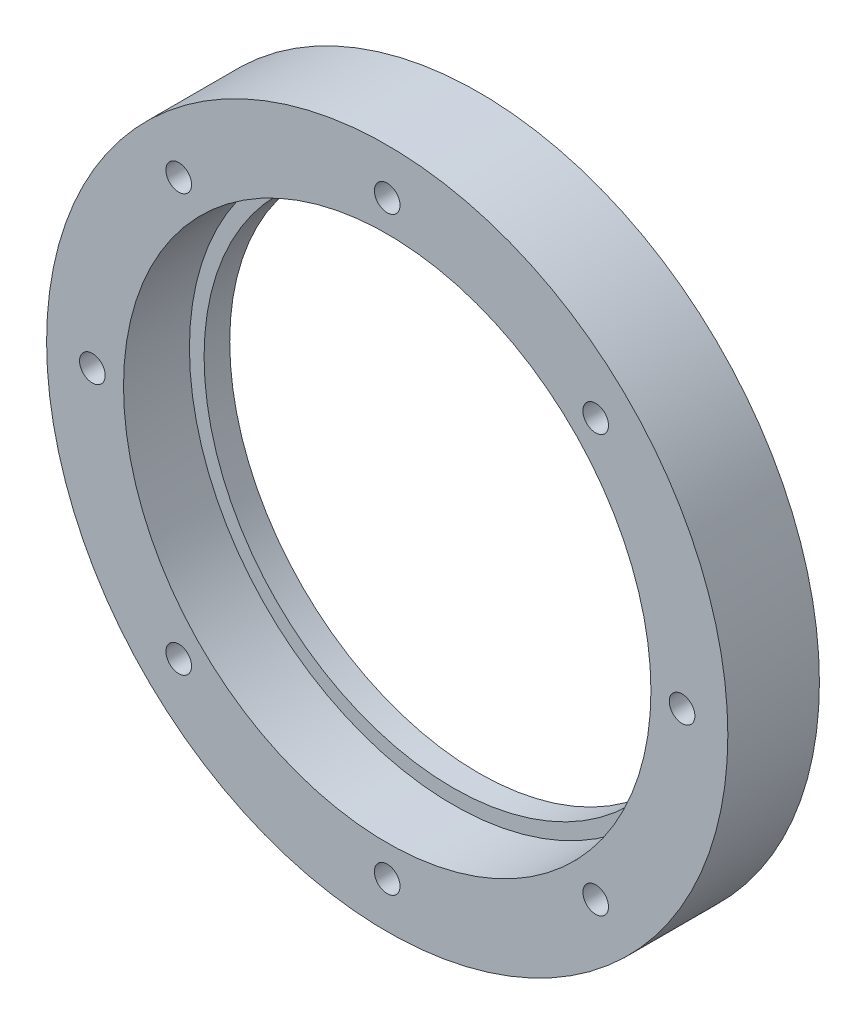
ISO-10303-21;
HEADER;
FILE_DESCRIPTION(('STEP AP214'),'2;1');
FILE_NAME('part.step','',(''),(''),'','','');
FILE_SCHEMA(('AUTOMOTIVE_DESIGN { 1 0 10303 214 1 1 1 1 }'));
ENDSEC;
DATA;
#1=APPLICATION_CONTEXT('core data for automotive mechanical design processes');
#2=APPLICATION_PROTOCOL_DEFINITION('international standard','automotive_design',2000,#1);
#3=PRODUCT_CONTEXT('',#1,'mechanical');
#4=PRODUCT('Part','Part','',(#3));
#5=PRODUCT_RELATED_PRODUCT_CATEGORY('part','',(#4));
#6=PRODUCT_DEFINITION_FORMATION('','',#4);
#7=PRODUCT_DEFINITION_CONTEXT('part definition',#1,'design');
#8=PRODUCT_DEFINITION('design','',#6,#7);
#9=PRODUCT_DEFINITION_SHAPE('','',#8);
#10=(LENGTH_UNIT() NAMED_UNIT(*) SI_UNIT(.MILLI.,.METRE.));
#11=(NAMED_UNIT(*) PLANE_ANGLE_UNIT() SI_UNIT($,.RADIAN.));
#12=(NAMED_UNIT(*) SI_UNIT($,.STERADIAN.) SOLID_ANGLE_UNIT());
#13=UNCERTAINTY_MEASURE_WITH_UNIT(LENGTH_MEASURE(1.E-05),#10,'distance_accuracy_value','');
#14=(GEOMETRIC_REPRESENTATION_CONTEXT(3) GLOBAL_UNCERTAINTY_ASSIGNED_CONTEXT((#13)) GLOBAL_UNIT_ASSIGNED_CONTEXT((#10,
#11,#12)) REPRESENTATION_CONTEXT('',''));
#15=CARTESIAN_POINT('',(0.,0.,0.));
#16=DIRECTION('',(0.,0.,1.));
#17=DIRECTION('',(1.,0.,0.));
#18=AXIS2_PLACEMENT_3D('',#15,#16,#17);
#19=CARTESIAN_POINT('',(0.,0.,6.25));
#20=DIRECTION('',(0.,0.,1.));
#21=DIRECTION('',(1.,0.,0.));
#22=AXIS2_PLACEMENT_3D('',#19,#20,#21);
#23=PLANE('',#22);
#24=CARTESIAN_POINT('',(40.25,-1.40532123888436E-13,6.25));
#25=DIRECTION('',(0.,0.,1.));
#26=DIRECTION('',(0.,-1.,0.));
#27=AXIS2_PLACEMENT_3D('',#24,#25,#26);
#28=CIRCLE('',#27,1.75);
#29=CARTESIAN_POINT('',(40.25,-1.75000000000014,6.25));
#30=VERTEX_POINT('',#29);
#31=EDGE_CURVE('E99',#30,#30,#28,.T.);
#32=ORIENTED_EDGE('',*,*,#31,.F.);
#33=EDGE_LOOP('',(#32));
#34=FACE_BOUND('',#33,.T.);
#35=CARTESIAN_POINT('',(28.4610479427584,-28.4610479427587,6.25));
#36=DIRECTION('',(0.,0.,1.));
#37=DIRECTION('',(-0.707106781186551,-0.707106781186544,0.));
#38=AXIS2_PLACEMENT_3D('',#35,#36,#37);
#39=CIRCLE('',#38,1.75);
#40=CARTESIAN_POINT('',(27.2236110756819,-29.6984848098351,6.25));
#41=VERTEX_POINT('',#40);
#42=EDGE_CURVE('E93',#41,#41,#39,.T.);
#43=ORIENTED_EDGE('',*,*,#42,.F.);
#44=EDGE_LOOP('',(#43));
#45=FACE_BOUND('',#44,.T.);
#46=CARTESIAN_POINT('',(0.,-40.25,6.25));
#47=DIRECTION('',(0.,0.,1.));
#48=DIRECTION('',(-1.,0.,0.));
#49=AXIS2_PLACEMENT_3D('',#46,#47,#48);
#50=CIRCLE('',#49,1.75);
#51=CARTESIAN_POINT('',(-1.75,-40.25,6.25));
#52=VERTEX_POINT('',#51);
#53=EDGE_CURVE('E87',#52,#52,#50,.T.);
#54=ORIENTED_EDGE('',*,*,#53,.F.);
#55=EDGE_LOOP('',(#54));
#56=FACE_BOUND('',#55,.T.);
#57=CARTESIAN_POINT('',(-28.4610479427588,-28.4610479427583,6.25));
#58=DIRECTION('',(0.,0.,1.));
#59=DIRECTION('',(-0.707106781186541,0.707106781186554,0.));
#60=AXIS2_PLACEMENT_3D('',#57,#58,#59);
#61=CIRCLE('',#60,1.75);
#62=CARTESIAN_POINT('',(-29.6984848098352,-27.2236110756818,6.25));
#63=VERTEX_POINT('',#62);
#64=EDGE_CURVE('E80',#63,#63,#61,.T.);
#65=ORIENTED_EDGE('',*,*,#64,.F.);
#66=EDGE_LOOP('',(#65));
#67=FACE_BOUND('',#66,.T.);
#68=CARTESIAN_POINT('',(-40.25,4.21596371665308E-13,6.25));
#69=DIRECTION('',(0.,0.,1.));
#70=DIRECTION('',(0.,1.,0.));
#71=AXIS2_PLACEMENT_3D('',#68,#69,#70);
#72=CIRCLE('',#71,1.75);
#73=CARTESIAN_POINT('',(-40.25,1.75000000000042,6.25));
#74=VERTEX_POINT('',#73);
#75=EDGE_CURVE('E110',#74,#74,#72,.T.);
#76=ORIENTED_EDGE('',*,*,#75,.F.);
#77=EDGE_LOOP('',(#76));
#78=FACE_BOUND('',#77,.T.);
#79=CARTESIAN_POINT('',(-28.4610479427582,28.4610479427589,6.25));
#80=DIRECTION('',(0.,0.,1.));
#81=DIRECTION('',(0.707106781186556,0.707106781186539,0.));
#82=AXIS2_PLACEMENT_3D('',#79,#80,#81);
#83=CIRCLE('',#82,1.75);
#84=CARTESIAN_POINT('',(-27.2236110756817,29.6984848098353,6.25));
#85=VERTEX_POINT('',#84);
#86=EDGE_CURVE('E104',#85,#85,#83,.T.);
#87=ORIENTED_EDGE('',*,*,#86,.F.);
#88=EDGE_LOOP('',(#87));
#89=FACE_BOUND('',#88,.T.);
#90=CARTESIAN_POINT('',(28.4610479427586,28.4610479427585,6.25));
#91=DIRECTION('',(0.,0.,1.));
#92=DIRECTION('',(0.707106781186546,-0.707106781186549,0.));
#93=AXIS2_PLACEMENT_3D('',#90,#91,#92);
#94=CIRCLE('',#93,1.75);
#95=CARTESIAN_POINT('',(29.698484809835,27.223611075682,6.25));
#96=VERTEX_POINT('',#95);
#97=EDGE_CURVE('E74',#96,#96,#94,.T.);
#98=ORIENTED_EDGE('',*,*,#97,.F.);
#99=EDGE_LOOP('',(#98));
#100=FACE_BOUND('',#99,.T.);
#101=CARTESIAN_POINT('',(0.,40.25,6.25));
#102=DIRECTION('',(0.,0.,1.));
#103=DIRECTION('',(1.,0.,0.));
#104=AXIS2_PLACEMENT_3D('',#101,#102,#103);
#105=CIRCLE('',#104,1.75);
#106=CARTESIAN_POINT('',(1.75,40.25,6.25));
#107=VERTEX_POINT('',#106);
#108=EDGE_CURVE('E68',#107,#107,#105,.T.);
#109=ORIENTED_EDGE('',*,*,#108,.F.);
#110=EDGE_LOOP('',(#109));
#111=FACE_BOUND('',#110,.T.);
#112=CARTESIAN_POINT('',(0.,0.,6.25));
#113=DIRECTION('',(0.,0.,1.));
#114=DIRECTION('',(1.,0.,0.));
#115=AXIS2_PLACEMENT_3D('',#112,#113,#114);
#116=CIRCLE('',#115,46.5);
#117=CARTESIAN_POINT('',(46.5,0.,6.25));
#118=VERTEX_POINT('',#117);
#119=EDGE_CURVE('E48',#118,#118,#116,.T.);
#120=ORIENTED_EDGE('',*,*,#119,.T.);
#121=EDGE_LOOP('',(#120));
#122=FACE_BOUND('',#121,.T.);
#123=CARTESIAN_POINT('',(0.,0.,6.25));
#124=DIRECTION('',(0.,0.,1.));
#125=DIRECTION('',(1.,0.,0.));
#126=AXIS2_PLACEMENT_3D('',#123,#124,#125);
#127=CIRCLE('',#126,36.);
#128=CARTESIAN_POINT('',(36.,0.,6.25));
#129=VERTEX_POINT('',#128);
#130=EDGE_CURVE('E57',#129,#129,#127,.T.);
#131=ORIENTED_EDGE('',*,*,#130,.F.);
#132=EDGE_LOOP('',(#131));
#133=FACE_BOUND('',#132,.T.);
#134=ADVANCED_FACE('F41',(#34,#45,#56,#67,#78,#89,#100,#111,#122,#133),#23,.T.);
#135=CARTESIAN_POINT('',(0.,0.,-6.25));
#136=DIRECTION('',(0.,0.,1.));
#137=DIRECTION('',(1.,0.,0.));
#138=AXIS2_PLACEMENT_3D('',#135,#136,#137);
#139=PLANE('',#138);
#140=CARTESIAN_POINT('',(40.25,-1.40532123888436E-13,-6.25));
#141=DIRECTION('',(0.,0.,1.));
#142=DIRECTION('',(0.,-1.,0.));
#143=AXIS2_PLACEMENT_3D('',#140,#141,#142);
#144=CIRCLE('',#143,1.75);
#145=CARTESIAN_POINT('',(40.25,-1.75000000000014,-6.25));
#146=VERTEX_POINT('',#145);
#147=EDGE_CURVE('E77',#146,#146,#144,.T.);
#148=ORIENTED_EDGE('',*,*,#147,.T.);
#149=EDGE_LOOP('',(#148));
#150=FACE_BOUND('',#149,.T.);
#151=CARTESIAN_POINT('',(28.4610479427584,-28.4610479427587,-6.25));
#152=DIRECTION('',(0.,0.,1.));
#153=DIRECTION('',(-0.707106781186551,-0.707106781186544,0.));
#154=AXIS2_PLACEMENT_3D('',#151,#152,#153);
#155=CIRCLE('',#154,1.75);
#156=CARTESIAN_POINT('',(27.2236110756819,-29.6984848098351,-6.25));
#157=VERTEX_POINT('',#156);
#158=EDGE_CURVE('E96',#157,#157,#155,.T.);
#159=ORIENTED_EDGE('',*,*,#158,.T.);
#160=EDGE_LOOP('',(#159));
#161=FACE_BOUND('',#160,.T.);
#162=CARTESIAN_POINT('',(0.,-40.25,-6.25));
#163=DIRECTION('',(0.,0.,1.));
#164=DIRECTION('',(-1.,0.,0.));
#165=AXIS2_PLACEMENT_3D('',#162,#163,#164);
#166=CIRCLE('',#165,1.75);
#167=CARTESIAN_POINT('',(-1.75,-40.25,-6.25));
#168=VERTEX_POINT('',#167);
#169=EDGE_CURVE('E90',#168,#168,#166,.T.);
#170=ORIENTED_EDGE('',*,*,#169,.T.);
#171=EDGE_LOOP('',(#170));
#172=FACE_BOUND('',#171,.T.);
#173=CARTESIAN_POINT('',(-28.4610479427588,-28.4610479427583,-6.25));
#174=DIRECTION('',(0.,0.,1.));
#175=DIRECTION('',(-0.707106781186541,0.707106781186554,0.));
#176=AXIS2_PLACEMENT_3D('',#173,#174,#175);
#177=CIRCLE('',#176,1.75);
#178=CARTESIAN_POINT('',(-29.6984848098352,-27.2236110756818,-6.25));
#179=VERTEX_POINT('',#178);
#180=EDGE_CURVE('E83',#179,#179,#177,.T.);
#181=ORIENTED_EDGE('',*,*,#180,.T.);
#182=EDGE_LOOP('',(#181));
#183=FACE_BOUND('',#182,.T.);
#184=CARTESIAN_POINT('',(-40.25,4.21596371665308E-13,-6.25));
#185=DIRECTION('',(0.,0.,1.));
#186=DIRECTION('',(0.,1.,0.));
#187=AXIS2_PLACEMENT_3D('',#184,#185,#186);
#188=CIRCLE('',#187,1.75);
#189=CARTESIAN_POINT('',(-40.25,1.75000000000042,-6.25));
#190=VERTEX_POINT('',#189);
#191=EDGE_CURVE('E84',#190,#190,#188,.T.);
#192=ORIENTED_EDGE('',*,*,#191,.T.);
#193=EDGE_LOOP('',(#192));
#194=FACE_BOUND('',#193,.T.);
#195=CARTESIAN_POINT('',(-28.4610479427582,28.4610479427589,-6.25));
#196=DIRECTION('',(0.,0.,1.));
#197=DIRECTION('',(0.707106781186556,0.707106781186539,0.));
#198=AXIS2_PLACEMENT_3D('',#195,#196,#197);
#199=CIRCLE('',#198,1.75);
#200=CARTESIAN_POINT('',(-27.2236110756817,29.6984848098353,-6.25));
#201=VERTEX_POINT('',#200);
#202=EDGE_CURVE('E107',#201,#201,#199,.T.);
#203=ORIENTED_EDGE('',*,*,#202,.T.);
#204=EDGE_LOOP('',(#203));
#205=FACE_BOUND('',#204,.T.);
#206=CARTESIAN_POINT('',(28.4610479427586,28.4610479427585,-6.25));
#207=DIRECTION('',(0.,0.,1.));
#208=DIRECTION('',(0.707106781186546,-0.707106781186549,0.));
#209=AXIS2_PLACEMENT_3D('',#206,#207,#208);
#210=CIRCLE('',#209,1.75);
#211=CARTESIAN_POINT('',(29.698484809835,27.223611075682,-6.25));
#212=VERTEX_POINT('',#211);
#213=EDGE_CURVE('E71',#212,#212,#210,.T.);
#214=ORIENTED_EDGE('',*,*,#213,.T.);
#215=EDGE_LOOP('',(#214));
#216=FACE_BOUND('',#215,.T.);
#217=CARTESIAN_POINT('',(0.,40.25,-6.25));
#218=DIRECTION('',(0.,0.,1.));
#219=DIRECTION('',(1.,0.,0.));
#220=AXIS2_PLACEMENT_3D('',#217,#218,#219);
#221=CIRCLE('',#220,1.75);
#222=CARTESIAN_POINT('',(1.75,40.25,-6.25));
#223=VERTEX_POINT('',#222);
#224=EDGE_CURVE('E65',#223,#223,#221,.T.);
#225=ORIENTED_EDGE('',*,*,#224,.T.);
#226=EDGE_LOOP('',(#225));
#227=FACE_BOUND('',#226,.T.);
#228=CARTESIAN_POINT('',(0.,0.,-6.25));
#229=DIRECTION('',(0.,0.,1.));
#230=DIRECTION('',(1.,0.,0.));
#231=AXIS2_PLACEMENT_3D('',#228,#229,#230);
#232=CIRCLE('',#231,46.5);
#233=CARTESIAN_POINT('',(46.5,0.,-6.25));
#234=VERTEX_POINT('',#233);
#235=EDGE_CURVE('E52',#234,#234,#232,.T.);
#236=ORIENTED_EDGE('',*,*,#235,.F.);
#237=EDGE_LOOP('',(#236));
#238=FACE_BOUND('',#237,.T.);
#239=CARTESIAN_POINT('',(0.,0.,-6.25));
#240=DIRECTION('',(0.,0.,1.));
#241=DIRECTION('',(1.,0.,0.));
#242=AXIS2_PLACEMENT_3D('',#239,#240,#241);
#243=CIRCLE('',#242,34.);
#244=CARTESIAN_POINT('',(34.,0.,-6.25));
#245=VERTEX_POINT('',#244);
#246=EDGE_CURVE('E61',#245,#245,#243,.T.);
#247=ORIENTED_EDGE('',*,*,#246,.T.);
#248=EDGE_LOOP('',(#247));
#249=FACE_BOUND('',#248,.T.);
#250=ADVANCED_FACE('F116',(#150,#161,#172,#183,#194,#205,#216,#227,#238,#249),#139,.F.);
#251=CARTESIAN_POINT('',(0.,0.,6.25));
#252=DIRECTION('',(0.,0.,-1.));
#253=DIRECTION('',(-1.,0.,0.));
#254=AXIS2_PLACEMENT_3D('',#251,#252,#253);
#255=CYLINDRICAL_SURFACE('',#254,46.5);
#256=ORIENTED_EDGE('',*,*,#119,.F.);
#257=EDGE_LOOP('',(#256));
#258=FACE_BOUND('',#257,.T.);
#259=ORIENTED_EDGE('',*,*,#235,.T.);
#260=EDGE_LOOP('',(#259));
#261=FACE_BOUND('',#260,.T.);
#262=ADVANCED_FACE('F43',(#258,#261),#255,.T.);
#263=CARTESIAN_POINT('',(0.,0.,6.25));
#264=DIRECTION('',(0.,0.,-1.));
#265=DIRECTION('',(-1.,0.,0.));
#266=AXIS2_PLACEMENT_3D('',#263,#264,#265);
#267=CYLINDRICAL_SURFACE('',#266,36.);
#268=CARTESIAN_POINT('',(0.,0.,-2.75));
#269=DIRECTION('',(0.,0.,1.));
#270=DIRECTION('',(1.,0.,0.));
#271=AXIS2_PLACEMENT_3D('',#268,#269,#270);
#272=CIRCLE('',#271,36.);
#273=CARTESIAN_POINT('',(36.,0.,-2.75));
#274=VERTEX_POINT('',#273);
#275=EDGE_CURVE('E11',#274,#274,#272,.T.);
#276=ORIENTED_EDGE('',*,*,#275,.F.);
#277=EDGE_LOOP('',(#276));
#278=FACE_BOUND('',#277,.T.);
#279=ORIENTED_EDGE('',*,*,#130,.T.);
#280=EDGE_LOOP('',(#279));
#281=FACE_BOUND('',#280,.T.);
#282=ADVANCED_FACE('F139',(#278,#281),#267,.F.);
#283=CARTESIAN_POINT('',(0.,0.,108.073376490863));
#284=DIRECTION('',(0.,0.,-1.));
#285=DIRECTION('',(-1.,0.,0.));
#286=AXIS2_PLACEMENT_3D('',#283,#284,#285);
#287=CYLINDRICAL_SURFACE('',#286,34.);
#288=ORIENTED_EDGE('',*,*,#246,.F.);
#289=EDGE_LOOP('',(#288));
#290=FACE_BOUND('',#289,.T.);
#291=CARTESIAN_POINT('',(0.,0.,-2.75));
#292=DIRECTION('',(0.,0.,1.));
#293=DIRECTION('',(1.,0.,0.));
#294=AXIS2_PLACEMENT_3D('',#291,#292,#293);
#295=CIRCLE('',#294,34.);
#296=CARTESIAN_POINT('',(34.,0.,-2.75));
#297=VERTEX_POINT('',#296);
#298=EDGE_CURVE('E62',#297,#297,#295,.T.);
#299=ORIENTED_EDGE('',*,*,#298,.T.);
#300=EDGE_LOOP('',(#299));
#301=FACE_BOUND('',#300,.T.);
#302=ADVANCED_FACE('F141',(#290,#301),#287,.F.);
#303=CARTESIAN_POINT('',(0.,0.,-2.75));
#304=DIRECTION('',(0.,0.,1.));
#305=DIRECTION('',(1.,0.,0.));
#306=AXIS2_PLACEMENT_3D('',#303,#304,#305);
#307=PLANE('',#306);
#308=ORIENTED_EDGE('',*,*,#298,.F.);
#309=EDGE_LOOP('',(#308));
#310=FACE_BOUND('',#309,.T.);
#311=ORIENTED_EDGE('',*,*,#275,.T.);
#312=EDGE_LOOP('',(#311));
#313=FACE_BOUND('',#312,.T.);
#314=ADVANCED_FACE('F148',(#310,#313),#307,.T.);
#315=CARTESIAN_POINT('',(0.,40.25,-6.25));
#316=DIRECTION('',(0.,0.,1.));
#317=DIRECTION('',(1.,0.,0.));
#318=AXIS2_PLACEMENT_3D('',#315,#316,#317);
#319=CYLINDRICAL_SURFACE('',#318,1.75);
#320=ORIENTED_EDGE('',*,*,#224,.F.);
#321=EDGE_LOOP('',(#320));
#322=FACE_BOUND('',#321,.T.);
#323=ORIENTED_EDGE('',*,*,#108,.T.);
#324=EDGE_LOOP('',(#323));
#325=FACE_BOUND('',#324,.T.);
#326=ADVANCED_FACE('F182',(#322,#325),#319,.F.);
#327=CARTESIAN_POINT('',(28.4610479427586,28.4610479427585,-6.25));
#328=DIRECTION('',(0.,0.,1.));
#329=DIRECTION('',(1.,0.,0.));
#330=AXIS2_PLACEMENT_3D('',#327,#328,#329);
#331=CYLINDRICAL_SURFACE('',#330,1.75);
#332=ORIENTED_EDGE('',*,*,#213,.F.);
#333=EDGE_LOOP('',(#332));
#334=FACE_BOUND('',#333,.T.);
#335=ORIENTED_EDGE('',*,*,#97,.T.);
#336=EDGE_LOOP('',(#335));
#337=FACE_BOUND('',#336,.T.);
#338=ADVANCED_FACE('F180',(#334,#337),#331,.F.);
#339=CARTESIAN_POINT('',(-28.4610479427582,28.4610479427589,-6.25));
#340=DIRECTION('',(0.,0.,1.));
#341=DIRECTION('',(1.,0.,0.));
#342=AXIS2_PLACEMENT_3D('',#339,#340,#341);
#343=CYLINDRICAL_SURFACE('',#342,1.75);
#344=ORIENTED_EDGE('',*,*,#202,.F.);
#345=EDGE_LOOP('',(#344));
#346=FACE_BOUND('',#345,.T.);
#347=ORIENTED_EDGE('',*,*,#86,.T.);
#348=EDGE_LOOP('',(#347));
#349=FACE_BOUND('',#348,.T.);
#350=ADVANCED_FACE('F123',(#346,#349),#343,.F.);
#351=CARTESIAN_POINT('',(-40.25,4.21596371665308E-13,-6.25));
#352=DIRECTION('',(0.,0.,1.));
#353=DIRECTION('',(1.,0.,0.));
#354=AXIS2_PLACEMENT_3D('',#351,#352,#353);
#355=CYLINDRICAL_SURFACE('',#354,1.75);
#356=ORIENTED_EDGE('',*,*,#191,.F.);
#357=EDGE_LOOP('',(#356));
#358=FACE_BOUND('',#357,.T.);
#359=ORIENTED_EDGE('',*,*,#75,.T.);
#360=EDGE_LOOP('',(#359));
#361=FACE_BOUND('',#360,.T.);
#362=ADVANCED_FACE('F119',(#358,#361),#355,.F.);
#363=CARTESIAN_POINT('',(-28.4610479427588,-28.4610479427583,-6.25));
#364=DIRECTION('',(0.,0.,1.));
#365=DIRECTION('',(1.,0.,0.));
#366=AXIS2_PLACEMENT_3D('',#363,#364,#365);
#367=CYLINDRICAL_SURFACE('',#366,1.75);
#368=ORIENTED_EDGE('',*,*,#180,.F.);
#369=EDGE_LOOP('',(#368));
#370=FACE_BOUND('',#369,.T.);
#371=ORIENTED_EDGE('',*,*,#64,.T.);
#372=EDGE_LOOP('',(#371));
#373=FACE_BOUND('',#372,.T.);
#374=ADVANCED_FACE('F122',(#370,#373),#367,.F.);
#375=CARTESIAN_POINT('',(0.,-40.25,-6.25));
#376=DIRECTION('',(0.,0.,1.));
#377=DIRECTION('',(1.,0.,0.));
#378=AXIS2_PLACEMENT_3D('',#375,#376,#377);
#379=CYLINDRICAL_SURFACE('',#378,1.75);
#380=ORIENTED_EDGE('',*,*,#169,.F.);
#381=EDGE_LOOP('',(#380));
#382=FACE_BOUND('',#381,.T.);
#383=ORIENTED_EDGE('',*,*,#53,.T.);
#384=EDGE_LOOP('',(#383));
#385=FACE_BOUND('',#384,.T.);
#386=ADVANCED_FACE('F168',(#382,#385),#379,.F.);
#387=CARTESIAN_POINT('',(28.4610479427584,-28.4610479427587,-6.25));
#388=DIRECTION('',(0.,0.,1.));
#389=DIRECTION('',(1.,0.,0.));
#390=AXIS2_PLACEMENT_3D('',#387,#388,#389);
#391=CYLINDRICAL_SURFACE('',#390,1.75);
#392=ORIENTED_EDGE('',*,*,#158,.F.);
#393=EDGE_LOOP('',(#392));
#394=FACE_BOUND('',#393,.T.);
#395=ORIENTED_EDGE('',*,*,#42,.T.);
#396=EDGE_LOOP('',(#395));
#397=FACE_BOUND('',#396,.T.);
#398=ADVANCED_FACE('F175',(#394,#397),#391,.F.);
#399=CARTESIAN_POINT('',(40.25,-1.40532123888436E-13,-6.25));
#400=DIRECTION('',(0.,0.,1.));
#401=DIRECTION('',(1.,0.,0.));
#402=AXIS2_PLACEMENT_3D('',#399,#400,#401);
#403=CYLINDRICAL_SURFACE('',#402,1.75);
#404=ORIENTED_EDGE('',*,*,#147,.F.);
#405=EDGE_LOOP('',(#404));
#406=FACE_BOUND('',#405,.T.);
#407=ORIENTED_EDGE('',*,*,#31,.T.);
#408=EDGE_LOOP('',(#407));
#409=FACE_BOUND('',#408,.T.);
#410=ADVANCED_FACE('F263',(#406,#409),#403,.F.);
#411=CLOSED_SHELL('',(#134,#250,#262,#282,#302,#314,#326,#338,#350,#362,#374,#386,#398,#410));
#412=MANIFOLD_SOLID_BREP('B2',#411);
#413=ADVANCED_BREP_SHAPE_REPRESENTATION('',(#18,#412),#14);
#414=SHAPE_DEFINITION_REPRESENTATION(#9,#413);
ENDSEC;
END-ISO-10303-21;
